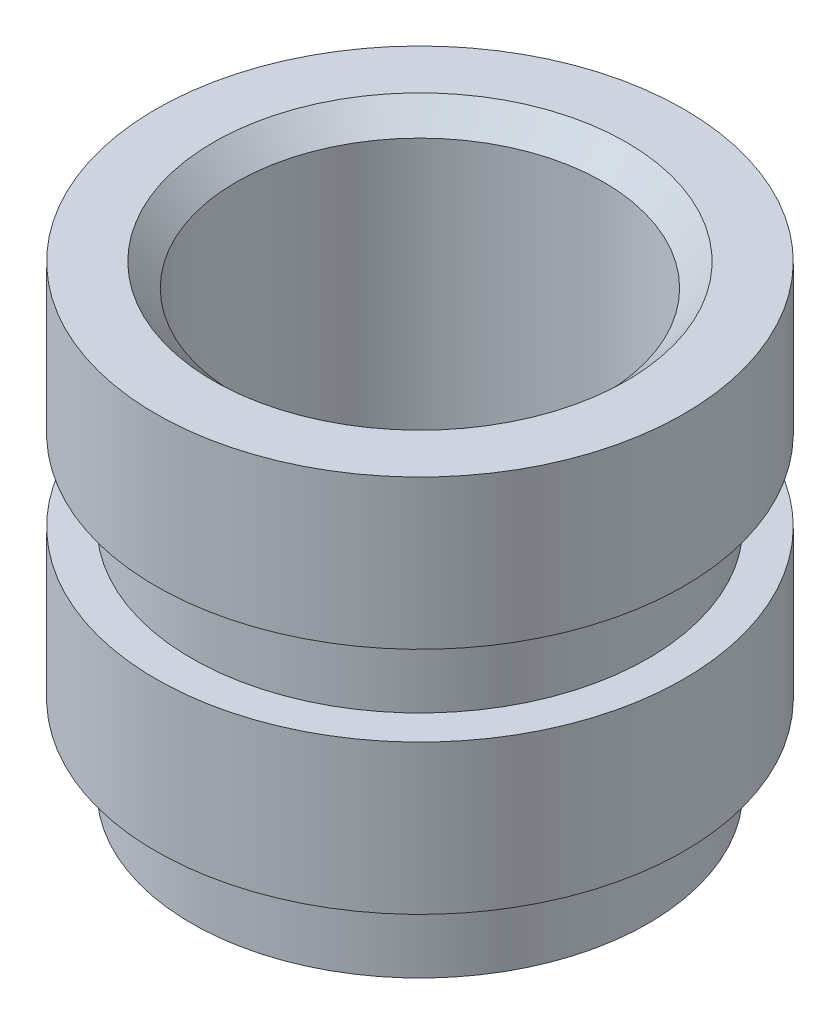
ISO-10303-21;
HEADER;
FILE_DESCRIPTION(('STEP AP214'),'2;1');
FILE_NAME('part.step','',(''),(''),'','','');
FILE_SCHEMA(('AUTOMOTIVE_DESIGN { 1 0 10303 214 1 1 1 1 }'));
ENDSEC;
DATA;
#1=APPLICATION_CONTEXT('core data for automotive mechanical design processes');
#2=APPLICATION_PROTOCOL_DEFINITION('international standard','automotive_design',2000,#1);
#3=PRODUCT_CONTEXT('',#1,'mechanical');
#4=PRODUCT('Part','Part','',(#3));
#5=PRODUCT_RELATED_PRODUCT_CATEGORY('part','',(#4));
#6=PRODUCT_DEFINITION_FORMATION('','',#4);
#7=PRODUCT_DEFINITION_CONTEXT('part definition',#1,'design');
#8=PRODUCT_DEFINITION('design','',#6,#7);
#9=PRODUCT_DEFINITION_SHAPE('','',#8);
#10=(LENGTH_UNIT() NAMED_UNIT(*) SI_UNIT(.MILLI.,.METRE.));
#11=(NAMED_UNIT(*) PLANE_ANGLE_UNIT() SI_UNIT($,.RADIAN.));
#12=(NAMED_UNIT(*) SI_UNIT($,.STERADIAN.) SOLID_ANGLE_UNIT());
#13=UNCERTAINTY_MEASURE_WITH_UNIT(LENGTH_MEASURE(1.E-05),#10,'distance_accuracy_value','');
#14=(GEOMETRIC_REPRESENTATION_CONTEXT(3) GLOBAL_UNCERTAINTY_ASSIGNED_CONTEXT((#13)) GLOBAL_UNIT_ASSIGNED_CONTEXT((#10,
#11,#12)) REPRESENTATION_CONTEXT('',''));
#15=CARTESIAN_POINT('',(0.,0.,0.));
#16=DIRECTION('',(0.,0.,1.));
#17=DIRECTION('',(1.,0.,0.));
#18=AXIS2_PLACEMENT_3D('',#15,#16,#17);
#19=CARTESIAN_POINT('',(-0.994666244142323,0.20844480004597,0.));
#20=DIRECTION('',(0.,-1.,0.));
#21=DIRECTION('',(0.,0.,-1.));
#22=AXIS2_PLACEMENT_3D('',#19,#20,#21);
#23=PLANE('',#22);
#24=CARTESIAN_POINT('',(0.,0.20844480004597,0.));
#25=DIRECTION('',(0.,-1.,0.));
#26=DIRECTION('',(0.,0.,-1.));
#27=AXIS2_PLACEMENT_3D('',#24,#25,#26);
#28=CIRCLE('',#27,1.15);
#29=CARTESIAN_POINT('',(0.,0.20844480004597,-1.15));
#30=VERTEX_POINT('',#29);
#31=EDGE_CURVE('E54',#30,#30,#28,.T.);
#32=ORIENTED_EDGE('',*,*,#31,.F.);
#33=EDGE_LOOP('',(#32));
#34=FACE_BOUND('',#33,.T.);
#35=CARTESIAN_POINT('',(0.,0.20844480004597,0.));
#36=DIRECTION('',(0.,-1.,0.));
#37=DIRECTION('',(0.,0.,-1.));
#38=AXIS2_PLACEMENT_3D('',#35,#36,#37);
#39=CIRCLE('',#38,0.994666244142323);
#40=CARTESIAN_POINT('',(0.,0.20844480004597,-0.994666244142323));
#41=VERTEX_POINT('',#40);
#42=EDGE_CURVE('E75',#41,#41,#39,.T.);
#43=ORIENTED_EDGE('',*,*,#42,.T.);
#44=EDGE_LOOP('',(#43));
#45=FACE_BOUND('',#44,.T.);
#46=ADVANCED_FACE('F34',(#34,#45),#23,.F.);
#47=CARTESIAN_POINT('',(0.,-2.60469314079422,0.));
#48=DIRECTION('',(0.,-1.,0.));
#49=DIRECTION('',(0.,0.,-1.));
#50=AXIS2_PLACEMENT_3D('',#47,#48,#49);
#51=CYLINDRICAL_SURFACE('',#50,1.15);
#52=CARTESIAN_POINT('',(0.,-0.44155519995403,0.));
#53=DIRECTION('',(0.,-1.,0.));
#54=DIRECTION('',(0.,0.,-1.));
#55=AXIS2_PLACEMENT_3D('',#52,#53,#54);
#56=CIRCLE('',#55,1.15);
#57=CARTESIAN_POINT('',(0.,-0.44155519995403,-1.15));
#58=VERTEX_POINT('',#57);
#59=EDGE_CURVE('E57',#58,#58,#56,.T.);
#60=ORIENTED_EDGE('',*,*,#59,.F.);
#61=EDGE_LOOP('',(#60));
#62=FACE_BOUND('',#61,.T.);
#63=ORIENTED_EDGE('',*,*,#31,.T.);
#64=EDGE_LOOP('',(#63));
#65=FACE_BOUND('',#64,.T.);
#66=ADVANCED_FACE('F110',(#62,#65),#51,.T.);
#67=CARTESIAN_POINT('',(-1.15,-0.44155519995403,0.));
#68=DIRECTION('',(0.,1.,0.));
#69=DIRECTION('',(0.,0.,1.));
#70=AXIS2_PLACEMENT_3D('',#67,#68,#69);
#71=PLANE('',#70);
#72=CARTESIAN_POINT('',(0.,-0.44155519995403,0.));
#73=DIRECTION('',(0.,-1.,0.));
#74=DIRECTION('',(0.,0.,-1.));
#75=AXIS2_PLACEMENT_3D('',#72,#73,#74);
#76=CIRCLE('',#75,0.994666244142323);
#77=CARTESIAN_POINT('',(0.,-0.44155519995403,-0.994666244142323));
#78=VERTEX_POINT('',#77);
#79=EDGE_CURVE('E60',#78,#78,#76,.T.);
#80=ORIENTED_EDGE('',*,*,#79,.F.);
#81=EDGE_LOOP('',(#80));
#82=FACE_BOUND('',#81,.T.);
#83=ORIENTED_EDGE('',*,*,#59,.T.);
#84=EDGE_LOOP('',(#83));
#85=FACE_BOUND('',#84,.T.);
#86=ADVANCED_FACE('F116',(#82,#85),#71,.F.);
#87=CARTESIAN_POINT('',(0.,-2.60469314079422,0.));
#88=DIRECTION('',(0.,-1.,0.));
#89=DIRECTION('',(0.,0.,-1.));
#90=AXIS2_PLACEMENT_3D('',#87,#88,#89);
#91=CYLINDRICAL_SURFACE('',#90,0.994666244142323);
#92=CARTESIAN_POINT('',(0.,-0.79155519995403,0.));
#93=DIRECTION('',(0.,-1.,0.));
#94=DIRECTION('',(0.,0.,-1.));
#95=AXIS2_PLACEMENT_3D('',#92,#93,#94);
#96=CIRCLE('',#95,0.994666244142323);
#97=CARTESIAN_POINT('',(0.,-0.79155519995403,-0.994666244142323));
#98=VERTEX_POINT('',#97);
#99=EDGE_CURVE('E63',#98,#98,#96,.T.);
#100=ORIENTED_EDGE('',*,*,#99,.F.);
#101=EDGE_LOOP('',(#100));
#102=FACE_BOUND('',#101,.T.);
#103=ORIENTED_EDGE('',*,*,#79,.T.);
#104=EDGE_LOOP('',(#103));
#105=FACE_BOUND('',#104,.T.);
#106=ADVANCED_FACE('F159',(#102,#105),#91,.T.);
#107=CARTESIAN_POINT('',(-0.8,-0.79155519995403,0.));
#108=DIRECTION('',(0.,1.,0.));
#109=DIRECTION('',(0.,0.,1.));
#110=AXIS2_PLACEMENT_3D('',#107,#108,#109);
#111=PLANE('',#110);
#112=CARTESIAN_POINT('',(0.,-0.79155519995403,0.));
#113=DIRECTION('',(0.,1.,0.));
#114=DIRECTION('',(0.,0.,1.));
#115=AXIS2_PLACEMENT_3D('',#112,#113,#114);
#116=CIRCLE('',#115,0.9);
#117=CARTESIAN_POINT('',(0.,-0.79155519995403,-0.9));
#118=VERTEX_POINT('',#117);
#119=EDGE_CURVE('E41',#118,#118,#116,.T.);
#120=ORIENTED_EDGE('',*,*,#119,.T.);
#121=EDGE_LOOP('',(#120));
#122=FACE_BOUND('',#121,.T.);
#123=ORIENTED_EDGE('',*,*,#99,.T.);
#124=EDGE_LOOP('',(#123));
#125=FACE_BOUND('',#124,.T.);
#126=ADVANCED_FACE('F106',(#122,#125),#111,.F.);
#127=CARTESIAN_POINT('',(0.,-2.60469314079422,0.));
#128=DIRECTION('',(0.,-1.,0.));
#129=DIRECTION('',(0.,0.,-1.));
#130=AXIS2_PLACEMENT_3D('',#127,#128,#129);
#131=CYLINDRICAL_SURFACE('',#130,0.8);
#132=CARTESIAN_POINT('',(0.,-0.69155519995403,0.));
#133=DIRECTION('',(0.,1.,0.));
#134=DIRECTION('',(0.,0.,1.));
#135=AXIS2_PLACEMENT_3D('',#132,#133,#134);
#136=CIRCLE('',#135,0.8);
#137=CARTESIAN_POINT('',(0.,-0.69155519995403,-0.8));
#138=VERTEX_POINT('',#137);
#139=EDGE_CURVE('E45',#138,#138,#136,.F.);
#140=ORIENTED_EDGE('',*,*,#139,.T.);
#141=EDGE_LOOP('',(#140));
#142=FACE_BOUND('',#141,.T.);
#143=CARTESIAN_POINT('',(0.,1.10844480004597,0.));
#144=DIRECTION('',(0.,-1.,0.));
#145=DIRECTION('',(0.,0.,-1.));
#146=AXIS2_PLACEMENT_3D('',#143,#144,#145);
#147=CIRCLE('',#146,0.8);
#148=CARTESIAN_POINT('',(0.,1.10844480004597,-0.8));
#149=VERTEX_POINT('',#148);
#150=EDGE_CURVE('E49',#149,#149,#147,.F.);
#151=ORIENTED_EDGE('',*,*,#150,.T.);
#152=EDGE_LOOP('',(#151));
#153=FACE_BOUND('',#152,.T.);
#154=ADVANCED_FACE('F101',(#142,#153),#131,.F.);
#155=CARTESIAN_POINT('',(-0.8,1.20844480004597,0.));
#156=DIRECTION('',(0.,-1.,0.));
#157=DIRECTION('',(0.,0.,-1.));
#158=AXIS2_PLACEMENT_3D('',#155,#156,#157);
#159=PLANE('',#158);
#160=CARTESIAN_POINT('',(0.,1.20844480004597,0.));
#161=DIRECTION('',(0.,-1.,0.));
#162=DIRECTION('',(0.,0.,-1.));
#163=AXIS2_PLACEMENT_3D('',#160,#161,#162);
#164=CIRCLE('',#163,0.900000000000001);
#165=CARTESIAN_POINT('',(0.,1.20844480004597,-0.900000000000001));
#166=VERTEX_POINT('',#165);
#167=EDGE_CURVE('E10',#166,#166,#164,.T.);
#168=ORIENTED_EDGE('',*,*,#167,.T.);
#169=EDGE_LOOP('',(#168));
#170=FACE_BOUND('',#169,.T.);
#171=CARTESIAN_POINT('',(0.,1.20844480004597,0.));
#172=DIRECTION('',(0.,-1.,0.));
#173=DIRECTION('',(0.,0.,-1.));
#174=AXIS2_PLACEMENT_3D('',#171,#172,#173);
#175=CIRCLE('',#174,1.15);
#176=CARTESIAN_POINT('',(0.,1.20844480004597,-1.15));
#177=VERTEX_POINT('',#176);
#178=EDGE_CURVE('E66',#177,#177,#175,.T.);
#179=ORIENTED_EDGE('',*,*,#178,.F.);
#180=EDGE_LOOP('',(#179));
#181=FACE_BOUND('',#180,.T.);
#182=ADVANCED_FACE('F96',(#170,#181),#159,.F.);
#183=CARTESIAN_POINT('',(0.,-2.60469314079422,0.));
#184=DIRECTION('',(0.,-1.,0.));
#185=DIRECTION('',(0.,0.,-1.));
#186=AXIS2_PLACEMENT_3D('',#183,#184,#185);
#187=CYLINDRICAL_SURFACE('',#186,1.15);
#188=CARTESIAN_POINT('',(0.,0.55844480004597,0.));
#189=DIRECTION('',(0.,-1.,0.));
#190=DIRECTION('',(0.,0.,-1.));
#191=AXIS2_PLACEMENT_3D('',#188,#189,#190);
#192=CIRCLE('',#191,1.15);
#193=CARTESIAN_POINT('',(0.,0.55844480004597,-1.15));
#194=VERTEX_POINT('',#193);
#195=EDGE_CURVE('E69',#194,#194,#192,.T.);
#196=ORIENTED_EDGE('',*,*,#195,.F.);
#197=EDGE_LOOP('',(#196));
#198=FACE_BOUND('',#197,.T.);
#199=ORIENTED_EDGE('',*,*,#178,.T.);
#200=EDGE_LOOP('',(#199));
#201=FACE_BOUND('',#200,.T.);
#202=ADVANCED_FACE('F90',(#198,#201),#187,.T.);
#203=CARTESIAN_POINT('',(-1.15,0.55844480004597,0.));
#204=DIRECTION('',(0.,1.,0.));
#205=DIRECTION('',(0.,0.,1.));
#206=AXIS2_PLACEMENT_3D('',#203,#204,#205);
#207=PLANE('',#206);
#208=CARTESIAN_POINT('',(0.,0.55844480004597,0.));
#209=DIRECTION('',(0.,-1.,0.));
#210=DIRECTION('',(0.,0.,-1.));
#211=AXIS2_PLACEMENT_3D('',#208,#209,#210);
#212=CIRCLE('',#211,0.994666244142323);
#213=CARTESIAN_POINT('',(0.,0.55844480004597,-0.994666244142323));
#214=VERTEX_POINT('',#213);
#215=EDGE_CURVE('E72',#214,#214,#212,.T.);
#216=ORIENTED_EDGE('',*,*,#215,.F.);
#217=EDGE_LOOP('',(#216));
#218=FACE_BOUND('',#217,.T.);
#219=ORIENTED_EDGE('',*,*,#195,.T.);
#220=EDGE_LOOP('',(#219));
#221=FACE_BOUND('',#220,.T.);
#222=ADVANCED_FACE('F84',(#218,#221),#207,.F.);
#223=CARTESIAN_POINT('',(0.,-2.60469314079422,0.));
#224=DIRECTION('',(0.,-1.,0.));
#225=DIRECTION('',(0.,0.,-1.));
#226=AXIS2_PLACEMENT_3D('',#223,#224,#225);
#227=CYLINDRICAL_SURFACE('',#226,0.994666244142323);
#228=ORIENTED_EDGE('',*,*,#42,.F.);
#229=EDGE_LOOP('',(#228));
#230=FACE_BOUND('',#229,.T.);
#231=ORIENTED_EDGE('',*,*,#215,.T.);
#232=EDGE_LOOP('',(#231));
#233=FACE_BOUND('',#232,.T.);
#234=ADVANCED_FACE('F80',(#230,#233),#227,.T.);
#235=CARTESIAN_POINT('',(0.,-0.69155519995403,0.));
#236=DIRECTION('',(0.,-1.,0.));
#237=DIRECTION('',(0.,0.,-1.));
#238=AXIS2_PLACEMENT_3D('',#235,#236,#237);
#239=CONICAL_SURFACE('',#238,0.8,0.785398163397448);
#240=CARTESIAN_POINT('',(0.,-0.79155519995403,-0.9));
#241=CARTESIAN_POINT('',(0.,-0.790513533287363,-0.898958333333333));
#242=CARTESIAN_POINT('',(0.,-0.789471866620697,-0.897916666666666));
#243=CARTESIAN_POINT('',(0.,-0.787388533287363,-0.895833333333333));
#244=CARTESIAN_POINT('',(0.,-0.786346866620697,-0.894791666666666));
#245=CARTESIAN_POINT('',(0.,-0.784263533287363,-0.892708333333333));
#246=CARTESIAN_POINT('',(0.,-0.783221866620697,-0.891666666666666));
#247=CARTESIAN_POINT('',(0.,-0.781138533287363,-0.889583333333333));
#248=CARTESIAN_POINT('',(0.,-0.780096866620697,-0.888541666666666));
#249=CARTESIAN_POINT('',(0.,-0.778013533287363,-0.886458333333333));
#250=CARTESIAN_POINT('',(0.,-0.776971866620697,-0.885416666666666));
#251=CARTESIAN_POINT('',(0.,-0.774888533287363,-0.883333333333333));
#252=CARTESIAN_POINT('',(0.,-0.773846866620697,-0.882291666666666));
#253=CARTESIAN_POINT('',(0.,-0.771763533287363,-0.880208333333333));
#254=CARTESIAN_POINT('',(0.,-0.770721866620697,-0.879166666666666));
#255=CARTESIAN_POINT('',(0.,-0.768638533287363,-0.877083333333333));
#256=CARTESIAN_POINT('',(0.,-0.767596866620697,-0.876041666666666));
#257=CARTESIAN_POINT('',(0.,-0.765513533287363,-0.873958333333333));
#258=CARTESIAN_POINT('',(0.,-0.764471866620697,-0.872916666666666));
#259=CARTESIAN_POINT('',(0.,-0.762388533287363,-0.870833333333333));
#260=CARTESIAN_POINT('',(0.,-0.761346866620697,-0.869791666666667));
#261=CARTESIAN_POINT('',(0.,-0.759263533287363,-0.867708333333333));
#262=CARTESIAN_POINT('',(0.,-0.758221866620697,-0.866666666666666));
#263=CARTESIAN_POINT('',(0.,-0.756138533287363,-0.864583333333333));
#264=CARTESIAN_POINT('',(0.,-0.755096866620697,-0.863541666666667));
#265=CARTESIAN_POINT('',(0.,-0.753013533287363,-0.861458333333333));
#266=CARTESIAN_POINT('',(0.,-0.751971866620697,-0.860416666666667));
#267=CARTESIAN_POINT('',(0.,-0.749888533287363,-0.858333333333333));
#268=CARTESIAN_POINT('',(0.,-0.748846866620697,-0.857291666666667));
#269=CARTESIAN_POINT('',(0.,-0.746763533287363,-0.855208333333333));
#270=CARTESIAN_POINT('',(0.,-0.745721866620697,-0.854166666666667));
#271=CARTESIAN_POINT('',(0.,-0.743638533287364,-0.852083333333333));
#272=CARTESIAN_POINT('',(0.,-0.742596866620697,-0.851041666666667));
#273=CARTESIAN_POINT('',(0.,-0.740513533287364,-0.848958333333333));
#274=CARTESIAN_POINT('',(0.,-0.739471866620697,-0.847916666666667));
#275=CARTESIAN_POINT('',(0.,-0.737388533287363,-0.845833333333333));
#276=CARTESIAN_POINT('',(0.,-0.736346866620697,-0.844791666666666));
#277=CARTESIAN_POINT('',(0.,-0.734263533287363,-0.842708333333333));
#278=CARTESIAN_POINT('',(0.,-0.733221866620697,-0.841666666666667));
#279=CARTESIAN_POINT('',(0.,-0.731138533287363,-0.839583333333333));
#280=CARTESIAN_POINT('',(0.,-0.730096866620697,-0.838541666666667));
#281=CARTESIAN_POINT('',(0.,-0.728013533287364,-0.836458333333333));
#282=CARTESIAN_POINT('',(0.,-0.726971866620697,-0.835416666666667));
#283=CARTESIAN_POINT('',(0.,-0.724888533287363,-0.833333333333333));
#284=CARTESIAN_POINT('',(0.,-0.723846866620697,-0.832291666666667));
#285=CARTESIAN_POINT('',(0.,-0.721763533287364,-0.830208333333333));
#286=CARTESIAN_POINT('',(0.,-0.720721866620697,-0.829166666666667));
#287=CARTESIAN_POINT('',(0.,-0.718638533287364,-0.827083333333333));
#288=CARTESIAN_POINT('',(0.,-0.717596866620697,-0.826041666666667));
#289=CARTESIAN_POINT('',(0.,-0.715513533287364,-0.823958333333333));
#290=CARTESIAN_POINT('',(0.,-0.714471866620697,-0.822916666666667));
#291=CARTESIAN_POINT('',(0.,-0.712388533287364,-0.820833333333333));
#292=CARTESIAN_POINT('',(0.,-0.711346866620697,-0.819791666666667));
#293=CARTESIAN_POINT('',(0.,-0.709263533287364,-0.817708333333333));
#294=CARTESIAN_POINT('',(0.,-0.708221866620697,-0.816666666666667));
#295=CARTESIAN_POINT('',(0.,-0.706138533287364,-0.814583333333333));
#296=CARTESIAN_POINT('',(0.,-0.705096866620697,-0.813541666666667));
#297=CARTESIAN_POINT('',(0.,-0.703013533287364,-0.811458333333333));
#298=CARTESIAN_POINT('',(0.,-0.701971866620697,-0.810416666666667));
#299=CARTESIAN_POINT('',(0.,-0.699888533287364,-0.808333333333333));
#300=CARTESIAN_POINT('',(0.,-0.698846866620697,-0.807291666666667));
#301=CARTESIAN_POINT('',(0.,-0.696763533287364,-0.805208333333333));
#302=CARTESIAN_POINT('',(0.,-0.695721866620697,-0.804166666666667));
#303=CARTESIAN_POINT('',(0.,-0.693638533287364,-0.802083333333333));
#304=CARTESIAN_POINT('',(0.,-0.692596866620697,-0.801041666666667));
#305=CARTESIAN_POINT('',(0.,-0.69155519995403,-0.8));
#306=B_SPLINE_CURVE_WITH_KNOTS('',3,(#240,#241,#242,#243,#244,#245,#246,#247,#248,#249,#250,
#251,#252,#253,#254,#255,#256,#257,#258,#259,#260,#261,#262,#263,#264,#265,#266,#267,#268,#269,
#270,#271,#272,#273,#274,#275,#276,#277,#278,#279,#280,#281,#282,#283,#284,#285,#286,#287,#288,
#289,#290,#291,#292,#293,#294,#295,#296,#297,#298,#299,#300,#301,#302,#303,#304,#305),
.UNSPECIFIED.,.F.,.F.,(4,2,2,2,2,2,2,2,2,2,2,2,2,2,2,2,2,2,2,2,2,2,2,2,2,2,2,2,2,2,2,2,4),(0.,
0.0044194173824159,0.00883883476483187,0.0132582521472478,0.0176776695296637,0.0220970869120796,
0.0265165042944955,0.0309359216769114,0.0353553390593273,0.0397747564417432,0.0441941738241591,
0.048613591206575,0.0530330085889909,0.0574524259714068,0.0618718433538227,0.0662912607362386,
0.0707106781186545,0.0751300955010705,0.0795495128834864,0.0839689302659023,0.0883883476483182,
0.0928077650307341,0.09722718241315,0.101646599795566,0.106066017177982,0.110485434560398,
0.114904851942814,0.11932426932523,0.123743686707645,0.128163104090061,0.132582521472477,
0.137001938854893,0.141421356237309),.UNSPECIFIED.);
#307=EDGE_CURVE('BSEAM83',#118,#138,#306,.T.);
#308=ORIENTED_EDGE('',*,*,#119,.F.);
#309=ORIENTED_EDGE('',*,*,#139,.F.);
#310=ORIENTED_EDGE('',*,*,#307,.T.);
#311=ORIENTED_EDGE('',*,*,#307,.F.);
#312=EDGE_LOOP('',(#308,#310,#309,#311));
#313=FACE_BOUND('',#312,.T.);
#314=ADVANCED_FACE('F83',(#313),#239,.F.);
#315=CARTESIAN_POINT('',(0.,1.20844480004597,0.));
#316=DIRECTION('',(0.,1.,0.));
#317=DIRECTION('',(0.,0.,1.));
#318=AXIS2_PLACEMENT_3D('',#315,#316,#317);
#319=CONICAL_SURFACE('',#318,0.900000000000001,0.785398163397448);
#320=ORIENTED_EDGE('',*,*,#150,.F.);
#321=EDGE_LOOP('',(#320));
#322=FACE_BOUND('',#321,.T.);
#323=ORIENTED_EDGE('',*,*,#167,.F.);
#324=EDGE_LOOP('',(#323));
#325=FACE_BOUND('',#324,.T.);
#326=ADVANCED_FACE('F36',(#322,#325),#319,.F.);
#327=CLOSED_SHELL('',(#46,#66,#86,#106,#126,#154,#182,#202,#222,#234,#314,#326));
#328=MANIFOLD_SOLID_BREP('B2',#327);
#329=ADVANCED_BREP_SHAPE_REPRESENTATION('',(#18,#328),#14);
#330=SHAPE_DEFINITION_REPRESENTATION(#9,#329);
ENDSEC;
END-ISO-10303-21;
